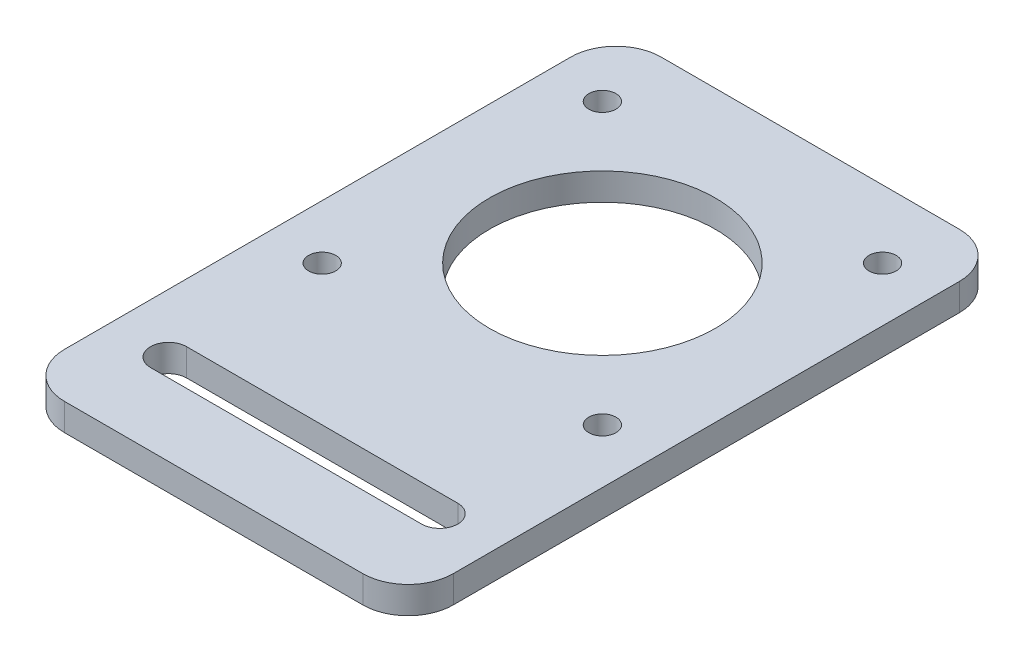
ISO-10303-21;
HEADER;
FILE_DESCRIPTION(('STEP AP214'),'2;1');
FILE_NAME('part.step','',(''),(''),'','','');
FILE_SCHEMA(('AUTOMOTIVE_DESIGN { 1 0 10303 214 1 1 1 1 }'));
ENDSEC;
DATA;
#1=APPLICATION_CONTEXT('core data for automotive mechanical design processes');
#2=APPLICATION_PROTOCOL_DEFINITION('international standard','automotive_design',2000,#1);
#3=PRODUCT_CONTEXT('',#1,'mechanical');
#4=PRODUCT('Part','Part','',(#3));
#5=PRODUCT_RELATED_PRODUCT_CATEGORY('part','',(#4));
#6=PRODUCT_DEFINITION_FORMATION('','',#4);
#7=PRODUCT_DEFINITION_CONTEXT('part definition',#1,'design');
#8=PRODUCT_DEFINITION('design','',#6,#7);
#9=PRODUCT_DEFINITION_SHAPE('','',#8);
#10=(LENGTH_UNIT() NAMED_UNIT(*) SI_UNIT(.MILLI.,.METRE.));
#11=(NAMED_UNIT(*) PLANE_ANGLE_UNIT() SI_UNIT($,.RADIAN.));
#12=(NAMED_UNIT(*) SI_UNIT($,.STERADIAN.) SOLID_ANGLE_UNIT());
#13=UNCERTAINTY_MEASURE_WITH_UNIT(LENGTH_MEASURE(1.E-05),#10,'distance_accuracy_value','');
#14=(GEOMETRIC_REPRESENTATION_CONTEXT(3) GLOBAL_UNCERTAINTY_ASSIGNED_CONTEXT((#13)) GLOBAL_UNIT_ASSIGNED_CONTEXT((#10,
#11,#12)) REPRESENTATION_CONTEXT('',''));
#15=CARTESIAN_POINT('',(0.,0.,0.));
#16=DIRECTION('',(0.,0.,1.));
#17=DIRECTION('',(1.,0.,0.));
#18=AXIS2_PLACEMENT_3D('',#15,#16,#17);
#19=CARTESIAN_POINT('',(-21.5,3.,-33.));
#20=DIRECTION('',(1.,0.,0.));
#21=DIRECTION('',(0.,0.,-1.));
#22=AXIS2_PLACEMENT_3D('',#19,#20,#21);
#23=PLANE('',#22);
#24=DIRECTION('',(0.,0.,1.));
#25=VECTOR('',#24,1.);
#26=CARTESIAN_POINT('',(-21.5,0.,-33.));
#27=LINE('',#26,#25);
#28=CARTESIAN_POINT('',(-21.5,0.,-28.));
#29=VERTEX_POINT('',#28);
#30=CARTESIAN_POINT('',(-21.5,0.,28.));
#31=VERTEX_POINT('',#30);
#32=EDGE_CURVE('E162',#29,#31,#27,.T.);
#33=ORIENTED_EDGE('',*,*,#32,.T.);
#34=DIRECTION('',(0.,-1.,0.));
#35=VECTOR('',#34,1.);
#36=CARTESIAN_POINT('',(-21.5,3.,28.));
#37=LINE('',#36,#35);
#38=CARTESIAN_POINT('',(-21.5,3.,28.));
#39=VERTEX_POINT('',#38);
#40=EDGE_CURVE('E243',#31,#39,#37,.F.);
#41=ORIENTED_EDGE('',*,*,#40,.T.);
#42=DIRECTION('',(0.,0.,1.));
#43=VECTOR('',#42,1.);
#44=CARTESIAN_POINT('',(-21.5,3.,-33.));
#45=LINE('',#44,#43);
#46=CARTESIAN_POINT('',(-21.5,3.,-28.));
#47=VERTEX_POINT('',#46);
#48=EDGE_CURVE('E195',#47,#39,#45,.T.);
#49=ORIENTED_EDGE('',*,*,#48,.F.);
#50=DIRECTION('',(0.,-1.,0.));
#51=VECTOR('',#50,1.);
#52=CARTESIAN_POINT('',(-21.5,3.,-28.));
#53=LINE('',#52,#51);
#54=EDGE_CURVE('E240',#47,#29,#53,.T.);
#55=ORIENTED_EDGE('',*,*,#54,.T.);
#56=EDGE_LOOP('',(#33,#41,#49,#55));
#57=FACE_BOUND('',#56,.T.);
#58=ADVANCED_FACE('F32',(#57),#23,.F.);
#59=CARTESIAN_POINT('',(21.5,3.,33.));
#60=DIRECTION('',(0.,0.,-1.));
#61=DIRECTION('',(-1.,0.,0.));
#62=AXIS2_PLACEMENT_3D('',#59,#60,#61);
#63=PLANE('',#62);
#64=DIRECTION('',(1.,0.,0.));
#65=VECTOR('',#64,1.);
#66=CARTESIAN_POINT('',(21.5,0.,33.));
#67=LINE('',#66,#65);
#68=CARTESIAN_POINT('',(-16.5,0.,33.));
#69=VERTEX_POINT('',#68);
#70=CARTESIAN_POINT('',(16.5,0.,33.));
#71=VERTEX_POINT('',#70);
#72=EDGE_CURVE('E209',#69,#71,#67,.T.);
#73=ORIENTED_EDGE('',*,*,#72,.T.);
#74=DIRECTION('',(0.,-1.,0.));
#75=VECTOR('',#74,1.);
#76=CARTESIAN_POINT('',(16.5,3.,33.));
#77=LINE('',#76,#75);
#78=CARTESIAN_POINT('',(16.5,3.,33.));
#79=VERTEX_POINT('',#78);
#80=EDGE_CURVE('E231',#71,#79,#77,.F.);
#81=ORIENTED_EDGE('',*,*,#80,.T.);
#82=DIRECTION('',(1.,0.,0.));
#83=VECTOR('',#82,1.);
#84=CARTESIAN_POINT('',(21.5,3.,33.));
#85=LINE('',#84,#83);
#86=CARTESIAN_POINT('',(-16.5,3.,33.));
#87=VERTEX_POINT('',#86);
#88=EDGE_CURVE('E198',#87,#79,#85,.T.);
#89=ORIENTED_EDGE('',*,*,#88,.F.);
#90=DIRECTION('',(0.,-1.,0.));
#91=VECTOR('',#90,1.);
#92=CARTESIAN_POINT('',(-16.5,3.,33.));
#93=LINE('',#92,#91);
#94=EDGE_CURVE('E228',#87,#69,#93,.T.);
#95=ORIENTED_EDGE('',*,*,#94,.T.);
#96=EDGE_LOOP('',(#73,#81,#89,#95));
#97=FACE_BOUND('',#96,.T.);
#98=ADVANCED_FACE('F267',(#97),#63,.F.);
#99=CARTESIAN_POINT('',(21.5,3.,-33.));
#100=DIRECTION('',(-1.,0.,0.));
#101=DIRECTION('',(0.,0.,1.));
#102=AXIS2_PLACEMENT_3D('',#99,#100,#101);
#103=PLANE('',#102);
#104=DIRECTION('',(0.,0.,-1.));
#105=VECTOR('',#104,1.);
#106=CARTESIAN_POINT('',(21.5,3.,-33.));
#107=LINE('',#106,#105);
#108=CARTESIAN_POINT('',(21.5,3.,28.));
#109=VERTEX_POINT('',#108);
#110=CARTESIAN_POINT('',(21.5,3.,-28.));
#111=VERTEX_POINT('',#110);
#112=EDGE_CURVE('E202',#109,#111,#107,.T.);
#113=ORIENTED_EDGE('',*,*,#112,.F.);
#114=DIRECTION('',(0.,-1.,0.));
#115=VECTOR('',#114,1.);
#116=CARTESIAN_POINT('',(21.5,3.,28.));
#117=LINE('',#116,#115);
#118=CARTESIAN_POINT('',(21.5,0.,28.));
#119=VERTEX_POINT('',#118);
#120=EDGE_CURVE('E217',#109,#119,#117,.T.);
#121=ORIENTED_EDGE('',*,*,#120,.T.);
#122=DIRECTION('',(0.,0.,-1.));
#123=VECTOR('',#122,1.);
#124=CARTESIAN_POINT('',(21.5,0.,-33.));
#125=LINE('',#124,#123);
#126=CARTESIAN_POINT('',(21.5,0.,-28.));
#127=VERTEX_POINT('',#126);
#128=EDGE_CURVE('E212',#119,#127,#125,.T.);
#129=ORIENTED_EDGE('',*,*,#128,.T.);
#130=DIRECTION('',(0.,-1.,0.));
#131=VECTOR('',#130,1.);
#132=CARTESIAN_POINT('',(21.5,3.,-28.));
#133=LINE('',#132,#131);
#134=EDGE_CURVE('E206',#127,#111,#133,.F.);
#135=ORIENTED_EDGE('',*,*,#134,.T.);
#136=EDGE_LOOP('',(#113,#121,#129,#135));
#137=FACE_BOUND('',#136,.T.);
#138=ADVANCED_FACE('F275',(#137),#103,.F.);
#139=CARTESIAN_POINT('',(21.5,3.,-33.));
#140=DIRECTION('',(0.,0.,1.));
#141=DIRECTION('',(1.,0.,0.));
#142=AXIS2_PLACEMENT_3D('',#139,#140,#141);
#143=PLANE('',#142);
#144=DIRECTION('',(-1.,0.,0.));
#145=VECTOR('',#144,1.);
#146=CARTESIAN_POINT('',(21.5,0.,-33.));
#147=LINE('',#146,#145);
#148=CARTESIAN_POINT('',(16.5,0.,-33.));
#149=VERTEX_POINT('',#148);
#150=CARTESIAN_POINT('',(-16.5,0.,-33.));
#151=VERTEX_POINT('',#150);
#152=EDGE_CURVE('E199',#149,#151,#147,.T.);
#153=ORIENTED_EDGE('',*,*,#152,.T.);
#154=DIRECTION('',(0.,-1.,0.));
#155=VECTOR('',#154,1.);
#156=CARTESIAN_POINT('',(-16.5,3.,-33.));
#157=LINE('',#156,#155);
#158=CARTESIAN_POINT('',(-16.5,3.,-33.));
#159=VERTEX_POINT('',#158);
#160=EDGE_CURVE('E11',#151,#159,#157,.F.);
#161=ORIENTED_EDGE('',*,*,#160,.T.);
#162=DIRECTION('',(-1.,0.,0.));
#163=VECTOR('',#162,1.);
#164=CARTESIAN_POINT('',(21.5,3.,-33.));
#165=LINE('',#164,#163);
#166=CARTESIAN_POINT('',(16.5,3.,-33.));
#167=VERTEX_POINT('',#166);
#168=EDGE_CURVE('E204',#167,#159,#165,.T.);
#169=ORIENTED_EDGE('',*,*,#168,.F.);
#170=DIRECTION('',(0.,-1.,0.));
#171=VECTOR('',#170,1.);
#172=CARTESIAN_POINT('',(16.5,3.,-33.));
#173=LINE('',#172,#171);
#174=EDGE_CURVE('E40',#167,#149,#173,.T.);
#175=ORIENTED_EDGE('',*,*,#174,.T.);
#176=EDGE_LOOP('',(#153,#161,#169,#175));
#177=FACE_BOUND('',#176,.T.);
#178=ADVANCED_FACE('F247',(#177),#143,.F.);
#179=CARTESIAN_POINT('',(0.,3.,0.));
#180=DIRECTION('',(0.,-1.,0.));
#181=DIRECTION('',(0.,0.,-1.));
#182=AXIS2_PLACEMENT_3D('',#179,#180,#181);
#183=PLANE('',#182);
#184=DIRECTION('',(1.,0.,0.));
#185=VECTOR('',#184,1.);
#186=CARTESIAN_POINT('',(-14.9999999999999,3.,25.));
#187=LINE('',#186,#185);
#188=CARTESIAN_POINT('',(-14.9999999999999,3.,25.));
#189=VERTEX_POINT('',#188);
#190=CARTESIAN_POINT('',(14.9999999999999,3.,25.));
#191=VERTEX_POINT('',#190);
#192=EDGE_CURVE('E155',#189,#191,#187,.T.);
#193=ORIENTED_EDGE('',*,*,#192,.F.);
#194=CARTESIAN_POINT('',(-14.9999999999999,3.,23.));
#195=DIRECTION('',(0.,1.,0.));
#196=DIRECTION('',(0.,0.,1.));
#197=AXIS2_PLACEMENT_3D('',#194,#195,#196);
#198=CIRCLE('',#197,2.);
#199=CARTESIAN_POINT('',(-14.9999999999999,3.,21.));
#200=VERTEX_POINT('',#199);
#201=EDGE_CURVE('E128',#200,#189,#198,.T.);
#202=ORIENTED_EDGE('',*,*,#201,.F.);
#203=DIRECTION('',(-1.,0.,0.));
#204=VECTOR('',#203,1.);
#205=CARTESIAN_POINT('',(-14.9999999999999,3.,21.));
#206=LINE('',#205,#204);
#207=CARTESIAN_POINT('',(15.0000000000001,3.,21.));
#208=VERTEX_POINT('',#207);
#209=EDGE_CURVE('E146',#208,#200,#206,.T.);
#210=ORIENTED_EDGE('',*,*,#209,.F.);
#211=CARTESIAN_POINT('',(15.0000000000001,3.,23.));
#212=DIRECTION('',(0.,1.,0.));
#213=DIRECTION('',(0.,0.,1.));
#214=AXIS2_PLACEMENT_3D('',#211,#212,#213);
#215=CIRCLE('',#214,2.00000000000001);
#216=EDGE_CURVE('E149',#191,#208,#215,.T.);
#217=ORIENTED_EDGE('',*,*,#216,.F.);
#218=EDGE_LOOP('',(#193,#202,#210,#217));
#219=FACE_BOUND('',#218,.T.);
#220=CARTESIAN_POINT('',(0.,3.,-9.99999999999999));
#221=DIRECTION('',(0.,1.,0.));
#222=DIRECTION('',(0.,0.,1.));
#223=AXIS2_PLACEMENT_3D('',#220,#221,#222);
#224=CIRCLE('',#223,12.5);
#225=CARTESIAN_POINT('',(0.,3.,2.50000000000001));
#226=VERTEX_POINT('',#225);
#227=EDGE_CURVE('E170',#226,#226,#224,.T.);
#228=ORIENTED_EDGE('',*,*,#227,.F.);
#229=EDGE_LOOP('',(#228));
#230=FACE_BOUND('',#229,.T.);
#231=CARTESIAN_POINT('',(15.5,3.,5.50000000000001));
#232=DIRECTION('',(0.,1.,0.));
#233=DIRECTION('',(0.,0.,1.));
#234=AXIS2_PLACEMENT_3D('',#231,#232,#233);
#235=CIRCLE('',#234,1.5);
#236=CARTESIAN_POINT('',(15.5,3.,7.00000000000001));
#237=VERTEX_POINT('',#236);
#238=EDGE_CURVE('E169',#237,#237,#235,.T.);
#239=ORIENTED_EDGE('',*,*,#238,.F.);
#240=EDGE_LOOP('',(#239));
#241=FACE_BOUND('',#240,.T.);
#242=CARTESIAN_POINT('',(15.5,3.,-25.5));
#243=DIRECTION('',(0.,1.,0.));
#244=DIRECTION('',(0.,0.,1.));
#245=AXIS2_PLACEMENT_3D('',#242,#243,#244);
#246=CIRCLE('',#245,1.5);
#247=CARTESIAN_POINT('',(15.5,3.,-24.));
#248=VERTEX_POINT('',#247);
#249=EDGE_CURVE('E187',#248,#248,#246,.T.);
#250=ORIENTED_EDGE('',*,*,#249,.F.);
#251=EDGE_LOOP('',(#250));
#252=FACE_BOUND('',#251,.T.);
#253=CARTESIAN_POINT('',(-15.5,3.,5.50000000000001));
#254=DIRECTION('',(0.,1.,0.));
#255=DIRECTION('',(0.,0.,1.));
#256=AXIS2_PLACEMENT_3D('',#253,#254,#255);
#257=CIRCLE('',#256,1.5);
#258=CARTESIAN_POINT('',(-15.5,3.,7.00000000000001));
#259=VERTEX_POINT('',#258);
#260=EDGE_CURVE('E181',#259,#259,#257,.T.);
#261=ORIENTED_EDGE('',*,*,#260,.F.);
#262=EDGE_LOOP('',(#261));
#263=FACE_BOUND('',#262,.T.);
#264=CARTESIAN_POINT('',(-15.5,3.,-25.5));
#265=DIRECTION('',(0.,1.,0.));
#266=DIRECTION('',(0.,0.,1.));
#267=AXIS2_PLACEMENT_3D('',#264,#265,#266);
#268=CIRCLE('',#267,1.5);
#269=CARTESIAN_POINT('',(-15.5,3.,-24.));
#270=VERTEX_POINT('',#269);
#271=EDGE_CURVE('E175',#270,#270,#268,.T.);
#272=ORIENTED_EDGE('',*,*,#271,.F.);
#273=EDGE_LOOP('',(#272));
#274=FACE_BOUND('',#273,.T.);
#275=ORIENTED_EDGE('',*,*,#88,.T.);
#276=CARTESIAN_POINT('',(16.5,3.,28.));
#277=DIRECTION('',(0.,-1.,0.));
#278=DIRECTION('',(0.,0.,-1.));
#279=AXIS2_PLACEMENT_3D('',#276,#277,#278);
#280=CIRCLE('',#279,5.);
#281=EDGE_CURVE('E238',#79,#109,#280,.F.);
#282=ORIENTED_EDGE('',*,*,#281,.T.);
#283=ORIENTED_EDGE('',*,*,#112,.T.);
#284=CARTESIAN_POINT('',(16.5,3.,-28.));
#285=DIRECTION('',(0.,-1.,0.));
#286=DIRECTION('',(0.,0.,-1.));
#287=AXIS2_PLACEMENT_3D('',#284,#285,#286);
#288=CIRCLE('',#287,5.);
#289=EDGE_CURVE('E52',#111,#167,#288,.F.);
#290=ORIENTED_EDGE('',*,*,#289,.T.);
#291=ORIENTED_EDGE('',*,*,#168,.T.);
#292=CARTESIAN_POINT('',(-16.5,3.,-28.));
#293=DIRECTION('',(0.,-1.,0.));
#294=DIRECTION('',(0.,0.,-1.));
#295=AXIS2_PLACEMENT_3D('',#292,#293,#294);
#296=CIRCLE('',#295,5.);
#297=EDGE_CURVE('E234',#159,#47,#296,.F.);
#298=ORIENTED_EDGE('',*,*,#297,.T.);
#299=ORIENTED_EDGE('',*,*,#48,.T.);
#300=CARTESIAN_POINT('',(-16.5,3.,28.));
#301=DIRECTION('',(0.,-1.,0.));
#302=DIRECTION('',(0.,0.,-1.));
#303=AXIS2_PLACEMENT_3D('',#300,#301,#302);
#304=CIRCLE('',#303,5.);
#305=EDGE_CURVE('E236',#39,#87,#304,.F.);
#306=ORIENTED_EDGE('',*,*,#305,.T.);
#307=EDGE_LOOP('',(#275,#282,#283,#290,#291,#298,#299,#306));
#308=FACE_BOUND('',#307,.T.);
#309=ADVANCED_FACE('F260',(#219,#230,#241,#252,#263,#274,#308),#183,.F.);
#310=CARTESIAN_POINT('',(0.,0.,0.));
#311=DIRECTION('',(0.,-1.,0.));
#312=DIRECTION('',(0.,0.,-1.));
#313=AXIS2_PLACEMENT_3D('',#310,#311,#312);
#314=PLANE('',#313);
#315=CARTESIAN_POINT('',(-14.9999999999999,0.,23.));
#316=DIRECTION('',(0.,1.,0.));
#317=DIRECTION('',(0.,0.,1.));
#318=AXIS2_PLACEMENT_3D('',#315,#316,#317);
#319=CIRCLE('',#318,2.);
#320=CARTESIAN_POINT('',(-14.9999999999999,0.,21.));
#321=VERTEX_POINT('',#320);
#322=CARTESIAN_POINT('',(-14.9999999999999,0.,25.));
#323=VERTEX_POINT('',#322);
#324=EDGE_CURVE('E125',#321,#323,#319,.T.);
#325=ORIENTED_EDGE('',*,*,#324,.T.);
#326=DIRECTION('',(1.,0.,0.));
#327=VECTOR('',#326,1.);
#328=CARTESIAN_POINT('',(-14.9999999999999,0.,25.));
#329=LINE('',#328,#327);
#330=CARTESIAN_POINT('',(14.9999999999999,0.,25.));
#331=VERTEX_POINT('',#330);
#332=EDGE_CURVE('E137',#323,#331,#329,.T.);
#333=ORIENTED_EDGE('',*,*,#332,.T.);
#334=CARTESIAN_POINT('',(15.0000000000001,0.,23.));
#335=DIRECTION('',(0.,1.,0.));
#336=DIRECTION('',(0.,0.,1.));
#337=AXIS2_PLACEMENT_3D('',#334,#335,#336);
#338=CIRCLE('',#337,2.00000000000001);
#339=CARTESIAN_POINT('',(15.0000000000001,0.,21.));
#340=VERTEX_POINT('',#339);
#341=EDGE_CURVE('E141',#331,#340,#338,.T.);
#342=ORIENTED_EDGE('',*,*,#341,.T.);
#343=DIRECTION('',(-1.,0.,0.));
#344=VECTOR('',#343,1.);
#345=CARTESIAN_POINT('',(-14.9999999999999,0.,21.));
#346=LINE('',#345,#344);
#347=EDGE_CURVE('E133',#340,#321,#346,.T.);
#348=ORIENTED_EDGE('',*,*,#347,.T.);
#349=EDGE_LOOP('',(#325,#333,#342,#348));
#350=FACE_BOUND('',#349,.T.);
#351=CARTESIAN_POINT('',(0.,0.,-9.99999999999999));
#352=DIRECTION('',(0.,1.,0.));
#353=DIRECTION('',(0.,0.,1.));
#354=AXIS2_PLACEMENT_3D('',#351,#352,#353);
#355=CIRCLE('',#354,12.5);
#356=CARTESIAN_POINT('',(0.,0.,2.50000000000001));
#357=VERTEX_POINT('',#356);
#358=EDGE_CURVE('E166',#357,#357,#355,.T.);
#359=ORIENTED_EDGE('',*,*,#358,.T.);
#360=EDGE_LOOP('',(#359));
#361=FACE_BOUND('',#360,.T.);
#362=CARTESIAN_POINT('',(15.5,0.,5.50000000000001));
#363=DIRECTION('',(0.,1.,0.));
#364=DIRECTION('',(0.,0.,1.));
#365=AXIS2_PLACEMENT_3D('',#362,#363,#364);
#366=CIRCLE('',#365,1.5);
#367=CARTESIAN_POINT('',(15.5,0.,7.00000000000001));
#368=VERTEX_POINT('',#367);
#369=EDGE_CURVE('E190',#368,#368,#366,.T.);
#370=ORIENTED_EDGE('',*,*,#369,.T.);
#371=EDGE_LOOP('',(#370));
#372=FACE_BOUND('',#371,.T.);
#373=CARTESIAN_POINT('',(15.5,0.,-25.5));
#374=DIRECTION('',(0.,1.,0.));
#375=DIRECTION('',(0.,0.,1.));
#376=AXIS2_PLACEMENT_3D('',#373,#374,#375);
#377=CIRCLE('',#376,1.5);
#378=CARTESIAN_POINT('',(15.5,0.,-24.));
#379=VERTEX_POINT('',#378);
#380=EDGE_CURVE('E184',#379,#379,#377,.T.);
#381=ORIENTED_EDGE('',*,*,#380,.T.);
#382=EDGE_LOOP('',(#381));
#383=FACE_BOUND('',#382,.T.);
#384=CARTESIAN_POINT('',(-15.5,0.,5.50000000000001));
#385=DIRECTION('',(0.,1.,0.));
#386=DIRECTION('',(0.,0.,1.));
#387=AXIS2_PLACEMENT_3D('',#384,#385,#386);
#388=CIRCLE('',#387,1.5);
#389=CARTESIAN_POINT('',(-15.5,0.,7.00000000000001));
#390=VERTEX_POINT('',#389);
#391=EDGE_CURVE('E178',#390,#390,#388,.T.);
#392=ORIENTED_EDGE('',*,*,#391,.T.);
#393=EDGE_LOOP('',(#392));
#394=FACE_BOUND('',#393,.T.);
#395=CARTESIAN_POINT('',(-15.5,0.,-25.5));
#396=DIRECTION('',(0.,1.,0.));
#397=DIRECTION('',(0.,0.,1.));
#398=AXIS2_PLACEMENT_3D('',#395,#396,#397);
#399=CIRCLE('',#398,1.5);
#400=CARTESIAN_POINT('',(-15.5,0.,-24.));
#401=VERTEX_POINT('',#400);
#402=EDGE_CURVE('E156',#401,#401,#399,.T.);
#403=ORIENTED_EDGE('',*,*,#402,.T.);
#404=EDGE_LOOP('',(#403));
#405=FACE_BOUND('',#404,.T.);
#406=ORIENTED_EDGE('',*,*,#128,.F.);
#407=CARTESIAN_POINT('',(16.5,0.,28.));
#408=DIRECTION('',(0.,-1.,0.));
#409=DIRECTION('',(0.,0.,-1.));
#410=AXIS2_PLACEMENT_3D('',#407,#408,#409);
#411=CIRCLE('',#410,5.);
#412=EDGE_CURVE('E226',#119,#71,#411,.T.);
#413=ORIENTED_EDGE('',*,*,#412,.T.);
#414=ORIENTED_EDGE('',*,*,#72,.F.);
#415=CARTESIAN_POINT('',(-16.5,0.,28.));
#416=DIRECTION('',(0.,-1.,0.));
#417=DIRECTION('',(0.,0.,-1.));
#418=AXIS2_PLACEMENT_3D('',#415,#416,#417);
#419=CIRCLE('',#418,5.);
#420=EDGE_CURVE('E224',#69,#31,#419,.T.);
#421=ORIENTED_EDGE('',*,*,#420,.T.);
#422=ORIENTED_EDGE('',*,*,#32,.F.);
#423=CARTESIAN_POINT('',(-16.5,0.,-28.));
#424=DIRECTION('',(0.,-1.,0.));
#425=DIRECTION('',(0.,0.,-1.));
#426=AXIS2_PLACEMENT_3D('',#423,#424,#425);
#427=CIRCLE('',#426,5.);
#428=EDGE_CURVE('E222',#29,#151,#427,.T.);
#429=ORIENTED_EDGE('',*,*,#428,.T.);
#430=ORIENTED_EDGE('',*,*,#152,.F.);
#431=CARTESIAN_POINT('',(16.5,0.,-28.));
#432=DIRECTION('',(0.,-1.,0.));
#433=DIRECTION('',(0.,0.,-1.));
#434=AXIS2_PLACEMENT_3D('',#431,#432,#433);
#435=CIRCLE('',#434,5.);
#436=EDGE_CURVE('E220',#149,#127,#435,.T.);
#437=ORIENTED_EDGE('',*,*,#436,.T.);
#438=EDGE_LOOP('',(#406,#413,#414,#421,#422,#429,#430,#437));
#439=FACE_BOUND('',#438,.T.);
#440=ADVANCED_FACE('F143',(#350,#361,#372,#383,#394,#405,#439),#314,.T.);
#441=CARTESIAN_POINT('',(-15.5,0.,-25.5));
#442=DIRECTION('',(0.,1.,0.));
#443=DIRECTION('',(0.,0.,1.));
#444=AXIS2_PLACEMENT_3D('',#441,#442,#443);
#445=CYLINDRICAL_SURFACE('',#444,1.5);
#446=ORIENTED_EDGE('',*,*,#402,.F.);
#447=EDGE_LOOP('',(#446));
#448=FACE_BOUND('',#447,.T.);
#449=ORIENTED_EDGE('',*,*,#271,.T.);
#450=EDGE_LOOP('',(#449));
#451=FACE_BOUND('',#450,.T.);
#452=ADVANCED_FACE('F381',(#448,#451),#445,.F.);
#453=CARTESIAN_POINT('',(-15.5,0.,5.50000000000001));
#454=DIRECTION('',(0.,1.,0.));
#455=DIRECTION('',(0.,0.,1.));
#456=AXIS2_PLACEMENT_3D('',#453,#454,#455);
#457=CYLINDRICAL_SURFACE('',#456,1.5);
#458=ORIENTED_EDGE('',*,*,#391,.F.);
#459=EDGE_LOOP('',(#458));
#460=FACE_BOUND('',#459,.T.);
#461=ORIENTED_EDGE('',*,*,#260,.T.);
#462=EDGE_LOOP('',(#461));
#463=FACE_BOUND('',#462,.T.);
#464=ADVANCED_FACE('F372',(#460,#463),#457,.F.);
#465=CARTESIAN_POINT('',(15.5,0.,-25.5));
#466=DIRECTION('',(0.,1.,0.));
#467=DIRECTION('',(0.,0.,1.));
#468=AXIS2_PLACEMENT_3D('',#465,#466,#467);
#469=CYLINDRICAL_SURFACE('',#468,1.5);
#470=ORIENTED_EDGE('',*,*,#380,.F.);
#471=EDGE_LOOP('',(#470));
#472=FACE_BOUND('',#471,.T.);
#473=ORIENTED_EDGE('',*,*,#249,.T.);
#474=EDGE_LOOP('',(#473));
#475=FACE_BOUND('',#474,.T.);
#476=ADVANCED_FACE('F363',(#472,#475),#469,.F.);
#477=CARTESIAN_POINT('',(15.5,0.,5.50000000000001));
#478=DIRECTION('',(0.,1.,0.));
#479=DIRECTION('',(0.,0.,1.));
#480=AXIS2_PLACEMENT_3D('',#477,#478,#479);
#481=CYLINDRICAL_SURFACE('',#480,1.5);
#482=ORIENTED_EDGE('',*,*,#369,.F.);
#483=EDGE_LOOP('',(#482));
#484=FACE_BOUND('',#483,.T.);
#485=ORIENTED_EDGE('',*,*,#238,.T.);
#486=EDGE_LOOP('',(#485));
#487=FACE_BOUND('',#486,.T.);
#488=ADVANCED_FACE('F354',(#484,#487),#481,.F.);
#489=CARTESIAN_POINT('',(0.,0.,-9.99999999999999));
#490=DIRECTION('',(0.,1.,0.));
#491=DIRECTION('',(0.,0.,1.));
#492=AXIS2_PLACEMENT_3D('',#489,#490,#491);
#493=CYLINDRICAL_SURFACE('',#492,12.5);
#494=ORIENTED_EDGE('',*,*,#358,.F.);
#495=EDGE_LOOP('',(#494));
#496=FACE_BOUND('',#495,.T.);
#497=ORIENTED_EDGE('',*,*,#227,.T.);
#498=EDGE_LOOP('',(#497));
#499=FACE_BOUND('',#498,.T.);
#500=ADVANCED_FACE('F346',(#496,#499),#493,.F.);
#501=CARTESIAN_POINT('',(-14.9999999999999,0.,23.));
#502=DIRECTION('',(0.,1.,0.));
#503=DIRECTION('',(0.,0.,1.));
#504=AXIS2_PLACEMENT_3D('',#501,#502,#503);
#505=CYLINDRICAL_SURFACE('',#504,2.);
#506=ORIENTED_EDGE('',*,*,#201,.T.);
#507=DIRECTION('',(0.,1.,0.));
#508=VECTOR('',#507,1.);
#509=CARTESIAN_POINT('',(-14.9999999999999,0.,25.));
#510=LINE('',#509,#508);
#511=EDGE_CURVE('E121',#323,#189,#510,.T.);
#512=ORIENTED_EDGE('',*,*,#511,.F.);
#513=ORIENTED_EDGE('',*,*,#324,.F.);
#514=DIRECTION('',(0.,1.,0.));
#515=VECTOR('',#514,1.);
#516=CARTESIAN_POINT('',(-14.9999999999999,0.,21.));
#517=LINE('',#516,#515);
#518=EDGE_CURVE('E160',#321,#200,#517,.T.);
#519=ORIENTED_EDGE('',*,*,#518,.T.);
#520=EDGE_LOOP('',(#506,#512,#513,#519));
#521=FACE_BOUND('',#520,.T.);
#522=ADVANCED_FACE('F123',(#521),#505,.F.);
#523=CARTESIAN_POINT('',(-14.9999999999999,0.,21.));
#524=DIRECTION('',(0.,0.,-1.));
#525=DIRECTION('',(-1.,0.,0.));
#526=AXIS2_PLACEMENT_3D('',#523,#524,#525);
#527=PLANE('',#526);
#528=ORIENTED_EDGE('',*,*,#209,.T.);
#529=ORIENTED_EDGE('',*,*,#518,.F.);
#530=ORIENTED_EDGE('',*,*,#347,.F.);
#531=DIRECTION('',(0.,1.,0.));
#532=VECTOR('',#531,1.);
#533=CARTESIAN_POINT('',(15.0000000000001,0.,21.));
#534=LINE('',#533,#532);
#535=EDGE_CURVE('E163',#340,#208,#534,.T.);
#536=ORIENTED_EDGE('',*,*,#535,.T.);
#537=EDGE_LOOP('',(#528,#529,#530,#536));
#538=FACE_BOUND('',#537,.T.);
#539=ADVANCED_FACE('F329',(#538),#527,.F.);
#540=CARTESIAN_POINT('',(15.0000000000001,0.,23.));
#541=DIRECTION('',(0.,1.,0.));
#542=DIRECTION('',(0.,0.,1.));
#543=AXIS2_PLACEMENT_3D('',#540,#541,#542);
#544=CYLINDRICAL_SURFACE('',#543,2.00000000000001);
#545=ORIENTED_EDGE('',*,*,#216,.T.);
#546=ORIENTED_EDGE('',*,*,#535,.F.);
#547=ORIENTED_EDGE('',*,*,#341,.F.);
#548=DIRECTION('',(0.,1.,0.));
#549=VECTOR('',#548,1.);
#550=CARTESIAN_POINT('',(14.9999999999999,0.,25.));
#551=LINE('',#550,#549);
#552=EDGE_CURVE('E132',#331,#191,#551,.T.);
#553=ORIENTED_EDGE('',*,*,#552,.T.);
#554=EDGE_LOOP('',(#545,#546,#547,#553));
#555=FACE_BOUND('',#554,.T.);
#556=ADVANCED_FACE('F321',(#555),#544,.F.);
#557=CARTESIAN_POINT('',(-14.9999999999999,0.,25.));
#558=DIRECTION('',(0.,0.,1.));
#559=DIRECTION('',(1.,0.,0.));
#560=AXIS2_PLACEMENT_3D('',#557,#558,#559);
#561=PLANE('',#560);
#562=ORIENTED_EDGE('',*,*,#192,.T.);
#563=ORIENTED_EDGE('',*,*,#552,.F.);
#564=ORIENTED_EDGE('',*,*,#332,.F.);
#565=ORIENTED_EDGE('',*,*,#511,.T.);
#566=EDGE_LOOP('',(#562,#563,#564,#565));
#567=FACE_BOUND('',#566,.T.);
#568=ADVANCED_FACE('F138',(#567),#561,.F.);
#569=CARTESIAN_POINT('',(16.5,3.,28.));
#570=DIRECTION('',(0.,-1.,0.));
#571=DIRECTION('',(0.,0.,-1.));
#572=AXIS2_PLACEMENT_3D('',#569,#570,#571);
#573=CYLINDRICAL_SURFACE('',#572,5.);
#574=ORIENTED_EDGE('',*,*,#281,.F.);
#575=ORIENTED_EDGE('',*,*,#80,.F.);
#576=ORIENTED_EDGE('',*,*,#412,.F.);
#577=ORIENTED_EDGE('',*,*,#120,.F.);
#578=EDGE_LOOP('',(#574,#575,#576,#577));
#579=FACE_BOUND('',#578,.T.);
#580=ADVANCED_FACE('F272',(#579),#573,.T.);
#581=CARTESIAN_POINT('',(-16.5,3.,28.));
#582=DIRECTION('',(0.,-1.,0.));
#583=DIRECTION('',(0.,0.,-1.));
#584=AXIS2_PLACEMENT_3D('',#581,#582,#583);
#585=CYLINDRICAL_SURFACE('',#584,5.);
#586=ORIENTED_EDGE('',*,*,#305,.F.);
#587=ORIENTED_EDGE('',*,*,#40,.F.);
#588=ORIENTED_EDGE('',*,*,#420,.F.);
#589=ORIENTED_EDGE('',*,*,#94,.F.);
#590=EDGE_LOOP('',(#586,#587,#588,#589));
#591=FACE_BOUND('',#590,.T.);
#592=ADVANCED_FACE('F264',(#591),#585,.T.);
#593=CARTESIAN_POINT('',(-16.5,3.,-28.));
#594=DIRECTION('',(0.,-1.,0.));
#595=DIRECTION('',(0.,0.,-1.));
#596=AXIS2_PLACEMENT_3D('',#593,#594,#595);
#597=CYLINDRICAL_SURFACE('',#596,5.);
#598=ORIENTED_EDGE('',*,*,#297,.F.);
#599=ORIENTED_EDGE('',*,*,#160,.F.);
#600=ORIENTED_EDGE('',*,*,#428,.F.);
#601=ORIENTED_EDGE('',*,*,#54,.F.);
#602=EDGE_LOOP('',(#598,#599,#600,#601));
#603=FACE_BOUND('',#602,.T.);
#604=ADVANCED_FACE('F255',(#603),#597,.T.);
#605=CARTESIAN_POINT('',(16.5,3.,-28.));
#606=DIRECTION('',(0.,-1.,0.));
#607=DIRECTION('',(0.,0.,-1.));
#608=AXIS2_PLACEMENT_3D('',#605,#606,#607);
#609=CYLINDRICAL_SURFACE('',#608,5.);
#610=ORIENTED_EDGE('',*,*,#289,.F.);
#611=ORIENTED_EDGE('',*,*,#134,.F.);
#612=ORIENTED_EDGE('',*,*,#436,.F.);
#613=ORIENTED_EDGE('',*,*,#174,.F.);
#614=EDGE_LOOP('',(#610,#611,#612,#613));
#615=FACE_BOUND('',#614,.T.);
#616=ADVANCED_FACE('F34',(#615),#609,.T.);
#617=CLOSED_SHELL('',(#58,#98,#138,#178,#309,#440,#452,#464,#476,#488,#500,#522,#539,#556,#568,
#580,#592,#604,#616));
#618=MANIFOLD_SOLID_BREP('B2',#617);
#619=ADVANCED_BREP_SHAPE_REPRESENTATION('',(#18,#618),#14);
#620=SHAPE_DEFINITION_REPRESENTATION(#9,#619);
ENDSEC;
END-ISO-10303-21;
